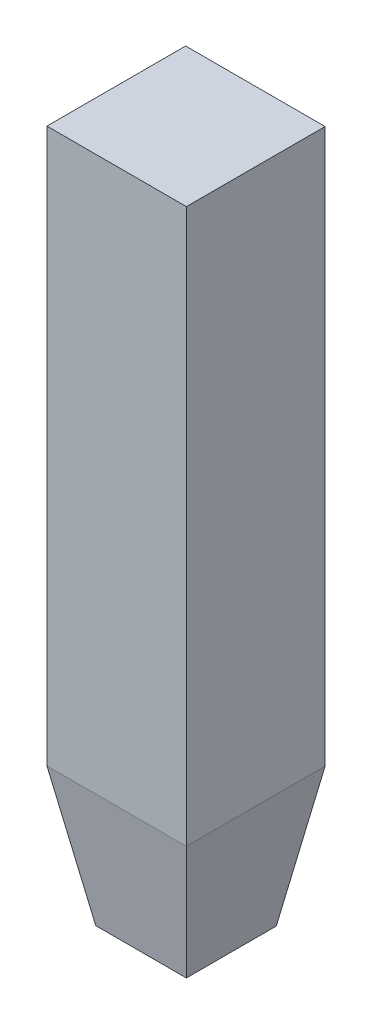
ISO-10303-21;
HEADER;
FILE_DESCRIPTION(('STEP AP214'),'2;1');
FILE_NAME('part.step','',(''),(''),'','','');
FILE_SCHEMA(('AUTOMOTIVE_DESIGN { 1 0 10303 214 1 1 1 1 }'));
ENDSEC;
DATA;
#1=APPLICATION_CONTEXT('core data for automotive mechanical design processes');
#2=APPLICATION_PROTOCOL_DEFINITION('international standard','automotive_design',2000,#1);
#3=PRODUCT_CONTEXT('',#1,'mechanical');
#4=PRODUCT('Part','Part','',(#3));
#5=PRODUCT_RELATED_PRODUCT_CATEGORY('part','',(#4));
#6=PRODUCT_DEFINITION_FORMATION('','',#4);
#7=PRODUCT_DEFINITION_CONTEXT('part definition',#1,'design');
#8=PRODUCT_DEFINITION('design','',#6,#7);
#9=PRODUCT_DEFINITION_SHAPE('','',#8);
#10=(LENGTH_UNIT() NAMED_UNIT(*) SI_UNIT(.MILLI.,.METRE.));
#11=(NAMED_UNIT(*) PLANE_ANGLE_UNIT() SI_UNIT($,.RADIAN.));
#12=(NAMED_UNIT(*) SI_UNIT($,.STERADIAN.) SOLID_ANGLE_UNIT());
#13=UNCERTAINTY_MEASURE_WITH_UNIT(LENGTH_MEASURE(1.E-05),#10,'distance_accuracy_value','');
#14=(GEOMETRIC_REPRESENTATION_CONTEXT(3) GLOBAL_UNCERTAINTY_ASSIGNED_CONTEXT((#13)) GLOBAL_UNIT_ASSIGNED_CONTEXT((#10,
#11,#12)) REPRESENTATION_CONTEXT('',''));
#15=CARTESIAN_POINT('',(0.,0.,0.));
#16=DIRECTION('',(0.,0.,1.));
#17=DIRECTION('',(1.,0.,0.));
#18=AXIS2_PLACEMENT_3D('',#15,#16,#17);
#19=CARTESIAN_POINT('',(-10.700881779,0.5,-1.930778121379));
#20=DIRECTION('',(0.,0.173648177667033,-0.98480775301219));
#21=DIRECTION('',(0.,0.98480775301219,0.173648177667033));
#22=AXIS2_PLACEMENT_3D('',#19,#20,#21);
#23=PLANE('',#22);
#24=DIRECTION('',(-1.,0.,0.));
#25=VECTOR('',#24,1.);
#26=CARTESIAN_POINT('',(-10.700881779,0.5,-1.930778121379));
#27=LINE('',#26,#25);
#28=CARTESIAN_POINT('',(-10.19737140048,0.5,-1.930778121379));
#29=VERTEX_POINT('',#28);
#30=CARTESIAN_POINT('',(-10.700881779,0.5,-1.930778121379));
#31=VERTEX_POINT('',#30);
#32=EDGE_CURVE('E71',#29,#31,#27,.T.);
#33=ORIENTED_EDGE('',*,*,#32,.T.);
#34=DIRECTION('',(0.171087869746143,-0.97028752524783,-0.171087869745838));
#35=VECTOR('',#34,1.);
#36=CARTESIAN_POINT('',(-10.700881779,0.5,-1.930778121379));
#37=LINE('',#36,#35);
#38=CARTESIAN_POINT('',(-10.6127182886479,3.78820239066435E-13,-2.01894161173307));
#39=VERTEX_POINT('',#38);
#40=EDGE_CURVE('E20',#31,#39,#37,.T.);
#41=ORIENTED_EDGE('',*,*,#40,.T.);
#42=DIRECTION('',(1.,0.,0.));
#43=VECTOR('',#42,1.);
#44=CARTESIAN_POINT('',(0.,0.,-2.018941611733));
#45=LINE('',#44,#43);
#46=CARTESIAN_POINT('',(-10.2855348908386,-2.32059922493366E-13,-2.01894161173307));
#47=VERTEX_POINT('',#46);
#48=EDGE_CURVE('E68',#39,#47,#45,.T.);
#49=ORIENTED_EDGE('',*,*,#48,.T.);
#50=DIRECTION('',(0.17108786974616,0.970287525247927,0.17108786974527));
#51=VECTOR('',#50,1.);
#52=CARTESIAN_POINT('',(-10.2855348908345,-9.77082997843937E-13,-2.018941611733));
#53=LINE('',#52,#51);
#54=EDGE_CURVE('E89',#47,#29,#53,.T.);
#55=ORIENTED_EDGE('',*,*,#54,.T.);
#56=EDGE_LOOP('',(#33,#41,#49,#55));
#57=FACE_BOUND('',#56,.T.);
#58=ADVANCED_FACE('F17',(#57),#23,.F.);
#59=CARTESIAN_POINT('',(-10.700881779,0.5,-2.431551723109));
#60=DIRECTION('',(0.98480775301219,0.173648177667033,0.));
#61=DIRECTION('',(-0.173648177667033,0.98480775301219,0.));
#62=AXIS2_PLACEMENT_3D('',#59,#60,#61);
#63=PLANE('',#62);
#64=DIRECTION('',(0.,0.,1.));
#65=VECTOR('',#64,1.);
#66=CARTESIAN_POINT('',(-10.61271828865,0.,0.));
#67=LINE('',#66,#65);
#68=CARTESIAN_POINT('',(-10.6127182886479,3.78766028957811E-13,-2.34338823275493));
#69=VERTEX_POINT('',#68);
#70=EDGE_CURVE('E76',#69,#39,#67,.T.);
#71=ORIENTED_EDGE('',*,*,#70,.T.);
#72=ORIENTED_EDGE('',*,*,#40,.F.);
#73=DIRECTION('',(0.,0.,-1.));
#74=VECTOR('',#73,1.);
#75=CARTESIAN_POINT('',(-10.700881779,0.5,-2.431551723109));
#76=LINE('',#75,#74);
#77=CARTESIAN_POINT('',(-10.700881779,0.5,-2.431551723109));
#78=VERTEX_POINT('',#77);
#79=EDGE_CURVE('E100',#31,#78,#76,.T.);
#80=ORIENTED_EDGE('',*,*,#79,.T.);
#81=DIRECTION('',(0.171087869738074,-0.970287525249158,0.171087869746378));
#82=VECTOR('',#81,1.);
#83=CARTESIAN_POINT('',(-10.700881779,0.5,-2.431551723109));
#84=LINE('',#83,#82);
#85=EDGE_CURVE('E86',#78,#69,#84,.T.);
#86=ORIENTED_EDGE('',*,*,#85,.T.);
#87=EDGE_LOOP('',(#71,#72,#80,#86));
#88=FACE_BOUND('',#87,.T.);
#89=ADVANCED_FACE('F85',(#88),#63,.F.);
#90=CARTESIAN_POINT('',(0.,0.,0.));
#91=DIRECTION('',(0.,1.,0.));
#92=DIRECTION('',(0.,0.,1.));
#93=AXIS2_PLACEMENT_3D('',#90,#91,#92);
#94=PLANE('',#93);
#95=ORIENTED_EDGE('',*,*,#70,.F.);
#96=DIRECTION('',(1.,0.,0.));
#97=VECTOR('',#96,1.);
#98=CARTESIAN_POINT('',(-10.700881779,0.,-2.34338823275472));
#99=LINE('',#98,#97);
#100=CARTESIAN_POINT('',(-10.2855348908386,-2.32019264911898E-13,-2.34338823275493));
#101=VERTEX_POINT('',#100);
#102=EDGE_CURVE('E103',#69,#101,#99,.T.);
#103=ORIENTED_EDGE('',*,*,#102,.T.);
#104=DIRECTION('',(0.,0.,1.));
#105=VECTOR('',#104,1.);
#106=CARTESIAN_POINT('',(-10.2855348908345,-9.77082997843937E-13,-2.431551723109));
#107=LINE('',#106,#105);
#108=EDGE_CURVE('E82',#101,#47,#107,.T.);
#109=ORIENTED_EDGE('',*,*,#108,.T.);
#110=ORIENTED_EDGE('',*,*,#48,.F.);
#111=EDGE_LOOP('',(#95,#103,#109,#110));
#112=FACE_BOUND('',#111,.T.);
#113=ADVANCED_FACE('F79',(#112),#94,.F.);
#114=CARTESIAN_POINT('',(-10.19737140048,0.5,-2.431551723109));
#115=DIRECTION('',(-0.98480775301219,0.173648177667033,0.));
#116=DIRECTION('',(-0.173648177667033,-0.98480775301219,0.));
#117=AXIS2_PLACEMENT_3D('',#114,#115,#116);
#118=PLANE('',#117);
#119=ORIENTED_EDGE('',*,*,#108,.F.);
#120=DIRECTION('',(0.171087869756913,0.970287525245936,-0.17108786974581));
#121=VECTOR('',#120,1.);
#122=CARTESIAN_POINT('',(-10.28553489084,0.,-2.34338823275472));
#123=LINE('',#122,#121);
#124=CARTESIAN_POINT('',(-10.19737140048,0.5,-2.431551723109));
#125=VERTEX_POINT('',#124);
#126=EDGE_CURVE('E105',#101,#125,#123,.T.);
#127=ORIENTED_EDGE('',*,*,#126,.T.);
#128=DIRECTION('',(0.,0.,1.));
#129=VECTOR('',#128,1.);
#130=CARTESIAN_POINT('',(-10.19737140048,0.5,-2.431551723109));
#131=LINE('',#130,#129);
#132=EDGE_CURVE('E34',#125,#29,#131,.T.);
#133=ORIENTED_EDGE('',*,*,#132,.T.);
#134=ORIENTED_EDGE('',*,*,#54,.F.);
#135=EDGE_LOOP('',(#119,#127,#133,#134));
#136=FACE_BOUND('',#135,.T.);
#137=ADVANCED_FACE('F153',(#136),#118,.F.);
#138=CARTESIAN_POINT('',(-10.700881779,2.5,-1.930778121379));
#139=DIRECTION('',(0.,0.,-1.));
#140=DIRECTION('',(-1.,0.,0.));
#141=AXIS2_PLACEMENT_3D('',#138,#139,#140);
#142=PLANE('',#141);
#143=ORIENTED_EDGE('',*,*,#32,.F.);
#144=DIRECTION('',(0.,1.,0.));
#145=VECTOR('',#144,1.);
#146=CARTESIAN_POINT('',(-10.19737140048,2.5,-1.930778121379));
#147=LINE('',#146,#145);
#148=CARTESIAN_POINT('',(-10.19737140048,2.5,-1.930778121379));
#149=VERTEX_POINT('',#148);
#150=EDGE_CURVE('E111',#29,#149,#147,.T.);
#151=ORIENTED_EDGE('',*,*,#150,.T.);
#152=DIRECTION('',(1.,0.,0.));
#153=VECTOR('',#152,1.);
#154=CARTESIAN_POINT('',(0.,2.5,-1.930778121379));
#155=LINE('',#154,#153);
#156=CARTESIAN_POINT('',(-10.700881779,2.5,-1.930778121379));
#157=VERTEX_POINT('',#156);
#158=EDGE_CURVE('E92',#157,#149,#155,.T.);
#159=ORIENTED_EDGE('',*,*,#158,.F.);
#160=DIRECTION('',(0.,1.,0.));
#161=VECTOR('',#160,1.);
#162=CARTESIAN_POINT('',(-10.700881779,2.5,-1.930778121379));
#163=LINE('',#162,#161);
#164=EDGE_CURVE('E97',#157,#31,#163,.F.);
#165=ORIENTED_EDGE('',*,*,#164,.T.);
#166=EDGE_LOOP('',(#143,#151,#159,#165));
#167=FACE_BOUND('',#166,.T.);
#168=ADVANCED_FACE('F150',(#167),#142,.F.);
#169=CARTESIAN_POINT('',(0.,2.5,0.));
#170=DIRECTION('',(0.,1.,0.));
#171=DIRECTION('',(0.,0.,1.));
#172=AXIS2_PLACEMENT_3D('',#169,#170,#171);
#173=PLANE('',#172);
#174=DIRECTION('',(0.,0.,-1.));
#175=VECTOR('',#174,1.);
#176=CARTESIAN_POINT('',(-10.700881779,2.5,-2.431551723109));
#177=LINE('',#176,#175);
#178=CARTESIAN_POINT('',(-10.700881779,2.5,-2.431551723109));
#179=VERTEX_POINT('',#178);
#180=EDGE_CURVE('E94',#179,#157,#177,.F.);
#181=ORIENTED_EDGE('',*,*,#180,.T.);
#182=ORIENTED_EDGE('',*,*,#158,.T.);
#183=DIRECTION('',(0.,0.,1.));
#184=VECTOR('',#183,1.);
#185=CARTESIAN_POINT('',(-10.19737140048,2.5,-2.431551723109));
#186=LINE('',#185,#184);
#187=CARTESIAN_POINT('',(-10.19737140048,2.5,-2.431551723109));
#188=VERTEX_POINT('',#187);
#189=EDGE_CURVE('E107',#149,#188,#186,.F.);
#190=ORIENTED_EDGE('',*,*,#189,.T.);
#191=DIRECTION('',(1.,0.,0.));
#192=VECTOR('',#191,1.);
#193=CARTESIAN_POINT('',(-10.700881779,2.5,-2.431551723109));
#194=LINE('',#193,#192);
#195=EDGE_CURVE('E114',#188,#179,#194,.F.);
#196=ORIENTED_EDGE('',*,*,#195,.T.);
#197=EDGE_LOOP('',(#181,#182,#190,#196));
#198=FACE_BOUND('',#197,.T.);
#199=ADVANCED_FACE('F133',(#198),#173,.T.);
#200=CARTESIAN_POINT('',(-10.700881779,2.5,-2.431551723109));
#201=DIRECTION('',(1.,0.,0.));
#202=DIRECTION('',(0.,0.,-1.));
#203=AXIS2_PLACEMENT_3D('',#200,#201,#202);
#204=PLANE('',#203);
#205=ORIENTED_EDGE('',*,*,#79,.F.);
#206=ORIENTED_EDGE('',*,*,#164,.F.);
#207=ORIENTED_EDGE('',*,*,#180,.F.);
#208=DIRECTION('',(0.,1.,0.));
#209=VECTOR('',#208,1.);
#210=CARTESIAN_POINT('',(-10.700881779,2.5,-2.431551723109));
#211=LINE('',#210,#209);
#212=EDGE_CURVE('E117',#179,#78,#211,.F.);
#213=ORIENTED_EDGE('',*,*,#212,.T.);
#214=EDGE_LOOP('',(#205,#206,#207,#213));
#215=FACE_BOUND('',#214,.T.);
#216=ADVANCED_FACE('F130',(#215),#204,.F.);
#217=CARTESIAN_POINT('',(-10.700881779,0.5,-2.431551723109));
#218=DIRECTION('',(0.,0.173648177667033,0.98480775301219));
#219=DIRECTION('',(0.,-0.98480775301219,0.173648177667033));
#220=AXIS2_PLACEMENT_3D('',#217,#218,#219);
#221=PLANE('',#220);
#222=ORIENTED_EDGE('',*,*,#102,.F.);
#223=ORIENTED_EDGE('',*,*,#85,.F.);
#224=DIRECTION('',(1.,0.,0.));
#225=VECTOR('',#224,1.);
#226=CARTESIAN_POINT('',(-10.700881779,0.5,-2.431551723109));
#227=LINE('',#226,#225);
#228=EDGE_CURVE('E26',#78,#125,#227,.T.);
#229=ORIENTED_EDGE('',*,*,#228,.T.);
#230=ORIENTED_EDGE('',*,*,#126,.F.);
#231=EDGE_LOOP('',(#222,#223,#229,#230));
#232=FACE_BOUND('',#231,.T.);
#233=ADVANCED_FACE('F124',(#232),#221,.F.);
#234=CARTESIAN_POINT('',(-10.19737140048,2.5,-2.431551723109));
#235=DIRECTION('',(-1.,0.,0.));
#236=DIRECTION('',(0.,0.,1.));
#237=AXIS2_PLACEMENT_3D('',#234,#235,#236);
#238=PLANE('',#237);
#239=ORIENTED_EDGE('',*,*,#132,.F.);
#240=DIRECTION('',(0.,1.,0.));
#241=VECTOR('',#240,1.);
#242=CARTESIAN_POINT('',(-10.19737140048,2.5,-2.431551723109));
#243=LINE('',#242,#241);
#244=EDGE_CURVE('E11',#125,#188,#243,.T.);
#245=ORIENTED_EDGE('',*,*,#244,.T.);
#246=ORIENTED_EDGE('',*,*,#189,.F.);
#247=ORIENTED_EDGE('',*,*,#150,.F.);
#248=EDGE_LOOP('',(#239,#245,#246,#247));
#249=FACE_BOUND('',#248,.T.);
#250=ADVANCED_FACE('F135',(#249),#238,.F.);
#251=CARTESIAN_POINT('',(-10.700881779,2.5,-2.431551723109));
#252=DIRECTION('',(0.,0.,1.));
#253=DIRECTION('',(1.,0.,0.));
#254=AXIS2_PLACEMENT_3D('',#251,#252,#253);
#255=PLANE('',#254);
#256=ORIENTED_EDGE('',*,*,#228,.F.);
#257=ORIENTED_EDGE('',*,*,#212,.F.);
#258=ORIENTED_EDGE('',*,*,#195,.F.);
#259=ORIENTED_EDGE('',*,*,#244,.F.);
#260=EDGE_LOOP('',(#256,#257,#258,#259));
#261=FACE_BOUND('',#260,.T.);
#262=ADVANCED_FACE('F128',(#261),#255,.F.);
#263=CLOSED_SHELL('',(#58,#89,#113,#137,#168,#199,#216,#233,#250,#262));
#264=MANIFOLD_SOLID_BREP('B1',#263);
#265=ADVANCED_BREP_SHAPE_REPRESENTATION('',(#18,#264),#14);
#266=SHAPE_DEFINITION_REPRESENTATION(#9,#265);
ENDSEC;
END-ISO-10303-21;
